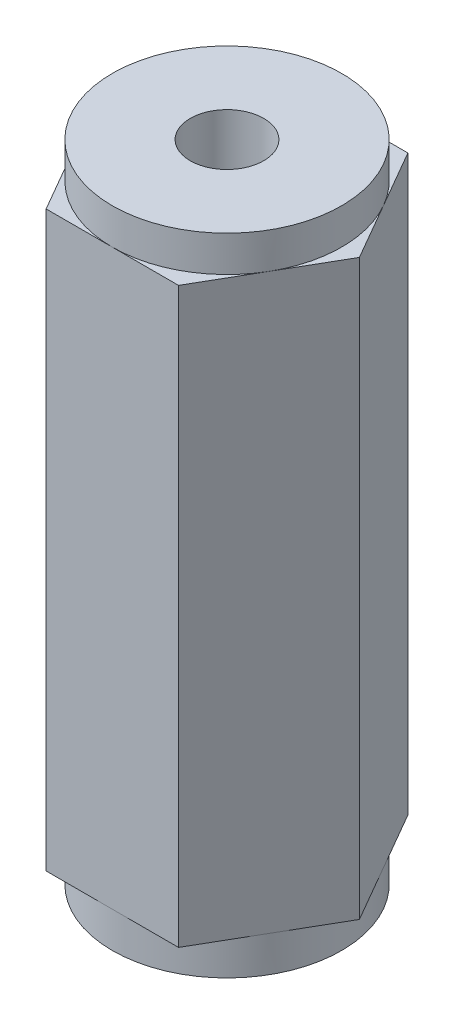
ISO-10303-21;
HEADER;
FILE_DESCRIPTION(('STEP AP214'),'2;1');
FILE_NAME('part.step','',(''),(''),'','','');
FILE_SCHEMA(('AUTOMOTIVE_DESIGN { 1 0 10303 214 1 1 1 1 }'));
ENDSEC;
DATA;
#1=APPLICATION_CONTEXT('core data for automotive mechanical design processes');
#2=APPLICATION_PROTOCOL_DEFINITION('international standard','automotive_design',2000,#1);
#3=PRODUCT_CONTEXT('',#1,'mechanical');
#4=PRODUCT('Part','Part','',(#3));
#5=PRODUCT_RELATED_PRODUCT_CATEGORY('part','',(#4));
#6=PRODUCT_DEFINITION_FORMATION('','',#4);
#7=PRODUCT_DEFINITION_CONTEXT('part definition',#1,'design');
#8=PRODUCT_DEFINITION('design','',#6,#7);
#9=PRODUCT_DEFINITION_SHAPE('','',#8);
#10=(LENGTH_UNIT() NAMED_UNIT(*) SI_UNIT(.MILLI.,.METRE.));
#11=(NAMED_UNIT(*) PLANE_ANGLE_UNIT() SI_UNIT($,.RADIAN.));
#12=(NAMED_UNIT(*) SI_UNIT($,.STERADIAN.) SOLID_ANGLE_UNIT());
#13=UNCERTAINTY_MEASURE_WITH_UNIT(LENGTH_MEASURE(1.E-05),#10,'distance_accuracy_value','');
#14=(GEOMETRIC_REPRESENTATION_CONTEXT(3) GLOBAL_UNCERTAINTY_ASSIGNED_CONTEXT((#13)) GLOBAL_UNIT_ASSIGNED_CONTEXT((#10,
#11,#12)) REPRESENTATION_CONTEXT('',''));
#15=CARTESIAN_POINT('',(0.,0.,0.));
#16=DIRECTION('',(0.,0.,1.));
#17=DIRECTION('',(1.,0.,0.));
#18=AXIS2_PLACEMENT_3D('',#15,#16,#17);
#19=CARTESIAN_POINT('',(1.84752086140684,9.,3.19999999999998));
#20=DIRECTION('',(-0.866025403784442,0.,-0.499999999999995));
#21=DIRECTION('',(-0.499999999999995,0.,0.866025403784442));
#22=AXIS2_PLACEMENT_3D('',#19,#20,#21);
#23=PLANE('',#22);
#24=DIRECTION('',(-0.499999999999995,0.,0.866025403784442));
#25=VECTOR('',#24,1.);
#26=CARTESIAN_POINT('',(1.84752086140684,-8.,3.19999999999998));
#27=LINE('',#26,#25);
#28=CARTESIAN_POINT('',(3.69504172281361,-8.,0.));
#29=VERTEX_POINT('',#28);
#30=CARTESIAN_POINT('',(2.77128129211022,-8.,1.59999999999999));
#31=VERTEX_POINT('',#30);
#32=EDGE_CURVE('E162',#29,#31,#27,.T.);
#33=ORIENTED_EDGE('',*,*,#32,.F.);
#34=DIRECTION('',(0.,-1.,0.));
#35=VECTOR('',#34,1.);
#36=CARTESIAN_POINT('',(3.69504172281361,9.,0.));
#37=LINE('',#36,#35);
#38=CARTESIAN_POINT('',(3.69504172281361,8.,0.));
#39=VERTEX_POINT('',#38);
#40=EDGE_CURVE('E205',#39,#29,#37,.T.);
#41=ORIENTED_EDGE('',*,*,#40,.F.);
#42=DIRECTION('',(0.499999999999995,0.,-0.866025403784442));
#43=VECTOR('',#42,1.);
#44=CARTESIAN_POINT('',(1.84752086140684,8.,3.19999999999998));
#45=LINE('',#44,#43);
#46=CARTESIAN_POINT('',(2.77128129211022,8.,1.59999999999999));
#47=VERTEX_POINT('',#46);
#48=EDGE_CURVE('E187',#47,#39,#45,.T.);
#49=ORIENTED_EDGE('',*,*,#48,.F.);
#50=CARTESIAN_POINT('',(1.84752086140684,8.,3.19999999999998));
#51=VERTEX_POINT('',#50);
#52=EDGE_CURVE('E189',#51,#47,#45,.T.);
#53=ORIENTED_EDGE('',*,*,#52,.F.);
#54=DIRECTION('',(0.,-1.,0.));
#55=VECTOR('',#54,1.);
#56=CARTESIAN_POINT('',(1.84752086140684,9.,3.19999999999998));
#57=LINE('',#56,#55);
#58=CARTESIAN_POINT('',(1.84752086140684,-8.,3.19999999999998));
#59=VERTEX_POINT('',#58);
#60=EDGE_CURVE('E190',#51,#59,#57,.T.);
#61=ORIENTED_EDGE('',*,*,#60,.T.);
#62=EDGE_CURVE('E159',#31,#59,#27,.T.);
#63=ORIENTED_EDGE('',*,*,#62,.F.);
#64=EDGE_LOOP('',(#33,#41,#49,#53,#61,#63));
#65=FACE_BOUND('',#64,.T.);
#66=ADVANCED_FACE('F39',(#65),#23,.F.);
#67=CARTESIAN_POINT('',(3.69504172281361,9.,0.));
#68=DIRECTION('',(-0.866025403784438,0.,0.500000000000001));
#69=DIRECTION('',(0.500000000000001,0.,0.866025403784438));
#70=AXIS2_PLACEMENT_3D('',#67,#68,#69);
#71=PLANE('',#70);
#72=DIRECTION('',(0.500000000000001,0.,0.866025403784438));
#73=VECTOR('',#72,1.);
#74=CARTESIAN_POINT('',(3.69504172281361,-8.,0.));
#75=LINE('',#74,#73);
#76=CARTESIAN_POINT('',(1.8475208614068,-8.,-3.20000000000001));
#77=VERTEX_POINT('',#76);
#78=CARTESIAN_POINT('',(2.77128129211021,-8.,-1.60000000000001));
#79=VERTEX_POINT('',#78);
#80=EDGE_CURVE('E168',#77,#79,#75,.T.);
#81=ORIENTED_EDGE('',*,*,#80,.F.);
#82=DIRECTION('',(0.,-1.,0.));
#83=VECTOR('',#82,1.);
#84=CARTESIAN_POINT('',(1.8475208614068,9.,-3.20000000000001));
#85=LINE('',#84,#83);
#86=CARTESIAN_POINT('',(1.8475208614068,8.,-3.20000000000001));
#87=VERTEX_POINT('',#86);
#88=EDGE_CURVE('E202',#87,#77,#85,.T.);
#89=ORIENTED_EDGE('',*,*,#88,.F.);
#90=DIRECTION('',(-0.500000000000001,0.,-0.866025403784438));
#91=VECTOR('',#90,1.);
#92=CARTESIAN_POINT('',(3.69504172281361,8.,0.));
#93=LINE('',#92,#91);
#94=CARTESIAN_POINT('',(2.77128129211021,8.,-1.60000000000001));
#95=VERTEX_POINT('',#94);
#96=EDGE_CURVE('E184',#95,#87,#93,.T.);
#97=ORIENTED_EDGE('',*,*,#96,.F.);
#98=EDGE_CURVE('E186',#39,#95,#93,.T.);
#99=ORIENTED_EDGE('',*,*,#98,.F.);
#100=ORIENTED_EDGE('',*,*,#40,.T.);
#101=EDGE_CURVE('E165',#79,#29,#75,.T.);
#102=ORIENTED_EDGE('',*,*,#101,.F.);
#103=EDGE_LOOP('',(#81,#89,#97,#99,#100,#102));
#104=FACE_BOUND('',#103,.T.);
#105=ADVANCED_FACE('F246',(#104),#71,.F.);
#106=CARTESIAN_POINT('',(1.8475208614068,9.,-3.20000000000001));
#107=DIRECTION('',(0.,0.,1.));
#108=DIRECTION('',(1.,0.,0.));
#109=AXIS2_PLACEMENT_3D('',#106,#107,#108);
#110=PLANE('',#109);
#111=DIRECTION('',(1.,0.,0.));
#112=VECTOR('',#111,1.);
#113=CARTESIAN_POINT('',(1.8475208614068,-8.,-3.20000000000001));
#114=LINE('',#113,#112);
#115=CARTESIAN_POINT('',(-1.84752086140682,-8.,-3.19999999999999));
#116=VERTEX_POINT('',#115);
#117=CARTESIAN_POINT('',(0.,-8.,-3.20000000000001));
#118=VERTEX_POINT('',#117);
#119=EDGE_CURVE('E171',#116,#118,#114,.T.);
#120=ORIENTED_EDGE('',*,*,#119,.F.);
#121=DIRECTION('',(0.,-1.,0.));
#122=VECTOR('',#121,1.);
#123=CARTESIAN_POINT('',(-1.84752086140682,9.,-3.19999999999999));
#124=LINE('',#123,#122);
#125=CARTESIAN_POINT('',(-1.84752086140682,8.,-3.19999999999999));
#126=VERTEX_POINT('',#125);
#127=EDGE_CURVE('E199',#126,#116,#124,.T.);
#128=ORIENTED_EDGE('',*,*,#127,.F.);
#129=DIRECTION('',(-1.,0.,0.));
#130=VECTOR('',#129,1.);
#131=CARTESIAN_POINT('',(1.8475208614068,8.,-3.20000000000001));
#132=LINE('',#131,#130);
#133=CARTESIAN_POINT('',(0.,8.,-3.20000000000001));
#134=VERTEX_POINT('',#133);
#135=EDGE_CURVE('E181',#134,#126,#132,.T.);
#136=ORIENTED_EDGE('',*,*,#135,.F.);
#137=EDGE_CURVE('E183',#87,#134,#132,.T.);
#138=ORIENTED_EDGE('',*,*,#137,.F.);
#139=ORIENTED_EDGE('',*,*,#88,.T.);
#140=EDGE_CURVE('E169',#118,#77,#114,.T.);
#141=ORIENTED_EDGE('',*,*,#140,.F.);
#142=EDGE_LOOP('',(#120,#128,#136,#138,#139,#141));
#143=FACE_BOUND('',#142,.T.);
#144=ADVANCED_FACE('F258',(#143),#110,.F.);
#145=CARTESIAN_POINT('',(-1.84752086140682,9.,-3.19999999999999));
#146=DIRECTION('',(0.866025403784441,0.,0.499999999999995));
#147=DIRECTION('',(0.499999999999995,0.,-0.866025403784442));
#148=AXIS2_PLACEMENT_3D('',#145,#146,#147);
#149=PLANE('',#148);
#150=DIRECTION('',(0.499999999999995,0.,-0.866025403784442));
#151=VECTOR('',#150,1.);
#152=CARTESIAN_POINT('',(-1.84752086140682,-8.,-3.19999999999999));
#153=LINE('',#152,#151);
#154=CARTESIAN_POINT('',(-3.69504172281361,-8.,0.));
#155=VERTEX_POINT('',#154);
#156=CARTESIAN_POINT('',(-2.77128129211022,-8.,-1.59999999999999));
#157=VERTEX_POINT('',#156);
#158=EDGE_CURVE('E163',#155,#157,#153,.T.);
#159=ORIENTED_EDGE('',*,*,#158,.F.);
#160=DIRECTION('',(0.,-1.,0.));
#161=VECTOR('',#160,1.);
#162=CARTESIAN_POINT('',(-3.69504172281361,9.,0.));
#163=LINE('',#162,#161);
#164=CARTESIAN_POINT('',(-3.69504172281361,8.,0.));
#165=VERTEX_POINT('',#164);
#166=EDGE_CURVE('E196',#165,#155,#163,.T.);
#167=ORIENTED_EDGE('',*,*,#166,.F.);
#168=DIRECTION('',(-0.499999999999995,0.,0.866025403784442));
#169=VECTOR('',#168,1.);
#170=CARTESIAN_POINT('',(-1.84752086140682,8.,-3.19999999999999));
#171=LINE('',#170,#169);
#172=CARTESIAN_POINT('',(-2.77128129211022,8.,-1.59999999999999));
#173=VERTEX_POINT('',#172);
#174=EDGE_CURVE('E178',#173,#165,#171,.T.);
#175=ORIENTED_EDGE('',*,*,#174,.F.);
#176=EDGE_CURVE('E180',#126,#173,#171,.T.);
#177=ORIENTED_EDGE('',*,*,#176,.F.);
#178=ORIENTED_EDGE('',*,*,#127,.T.);
#179=EDGE_CURVE('E166',#157,#116,#153,.T.);
#180=ORIENTED_EDGE('',*,*,#179,.F.);
#181=EDGE_LOOP('',(#159,#167,#175,#177,#178,#180));
#182=FACE_BOUND('',#181,.T.);
#183=ADVANCED_FACE('F270',(#182),#149,.F.);
#184=CARTESIAN_POINT('',(-3.69504172281361,9.,0.));
#185=DIRECTION('',(0.866025403784434,0.,-0.500000000000007));
#186=DIRECTION('',(-0.500000000000007,0.,-0.866025403784435));
#187=AXIS2_PLACEMENT_3D('',#184,#185,#186);
#188=PLANE('',#187);
#189=DIRECTION('',(-0.500000000000007,0.,-0.866025403784435));
#190=VECTOR('',#189,1.);
#191=CARTESIAN_POINT('',(-3.69504172281361,-8.,0.));
#192=LINE('',#191,#190);
#193=CARTESIAN_POINT('',(-1.84752086140677,-8.,3.20000000000002));
#194=VERTEX_POINT('',#193);
#195=CARTESIAN_POINT('',(-2.7712812921102,-8.,1.60000000000003));
#196=VERTEX_POINT('',#195);
#197=EDGE_CURVE('E156',#194,#196,#192,.T.);
#198=ORIENTED_EDGE('',*,*,#197,.F.);
#199=DIRECTION('',(0.,-1.,0.));
#200=VECTOR('',#199,1.);
#201=CARTESIAN_POINT('',(-1.84752086140677,9.,3.20000000000002));
#202=LINE('',#201,#200);
#203=CARTESIAN_POINT('',(-1.84752086140677,8.,3.20000000000002));
#204=VERTEX_POINT('',#203);
#205=EDGE_CURVE('E193',#204,#194,#202,.T.);
#206=ORIENTED_EDGE('',*,*,#205,.F.);
#207=DIRECTION('',(0.500000000000007,0.,0.866025403784435));
#208=VECTOR('',#207,1.);
#209=CARTESIAN_POINT('',(-3.69504172281361,8.,0.));
#210=LINE('',#209,#208);
#211=CARTESIAN_POINT('',(-2.7712812921102,8.,1.60000000000003));
#212=VERTEX_POINT('',#211);
#213=EDGE_CURVE('E173',#212,#204,#210,.T.);
#214=ORIENTED_EDGE('',*,*,#213,.F.);
#215=EDGE_CURVE('E177',#165,#212,#210,.T.);
#216=ORIENTED_EDGE('',*,*,#215,.F.);
#217=ORIENTED_EDGE('',*,*,#166,.T.);
#218=EDGE_CURVE('E160',#196,#155,#192,.T.);
#219=ORIENTED_EDGE('',*,*,#218,.F.);
#220=EDGE_LOOP('',(#198,#206,#214,#216,#217,#219));
#221=FACE_BOUND('',#220,.T.);
#222=ADVANCED_FACE('F279',(#221),#188,.F.);
#223=CARTESIAN_POINT('',(-1.84752086140677,9.,3.20000000000002));
#224=DIRECTION('',(0.,0.,-1.));
#225=DIRECTION('',(-1.,0.,0.));
#226=AXIS2_PLACEMENT_3D('',#223,#224,#225);
#227=PLANE('',#226);
#228=DIRECTION('',(-1.,0.,0.));
#229=VECTOR('',#228,1.);
#230=CARTESIAN_POINT('',(-1.84752086140677,-8.,3.20000000000002));
#231=LINE('',#230,#229);
#232=CARTESIAN_POINT('',(0.,-8.,3.20000000000001));
#233=VERTEX_POINT('',#232);
#234=EDGE_CURVE('E12',#59,#233,#231,.T.);
#235=ORIENTED_EDGE('',*,*,#234,.F.);
#236=ORIENTED_EDGE('',*,*,#60,.F.);
#237=DIRECTION('',(1.,0.,0.));
#238=VECTOR('',#237,1.);
#239=CARTESIAN_POINT('',(-1.84752086140677,8.,3.20000000000002));
#240=LINE('',#239,#238);
#241=CARTESIAN_POINT('',(0.,8.,3.20000000000001));
#242=VERTEX_POINT('',#241);
#243=EDGE_CURVE('E211',#242,#51,#240,.T.);
#244=ORIENTED_EDGE('',*,*,#243,.F.);
#245=EDGE_CURVE('E212',#204,#242,#240,.T.);
#246=ORIENTED_EDGE('',*,*,#245,.F.);
#247=ORIENTED_EDGE('',*,*,#205,.T.);
#248=EDGE_CURVE('E42',#233,#194,#231,.T.);
#249=ORIENTED_EDGE('',*,*,#248,.F.);
#250=EDGE_LOOP('',(#235,#236,#244,#246,#247,#249));
#251=FACE_BOUND('',#250,.T.);
#252=ADVANCED_FACE('F229',(#251),#227,.F.);
#253=CARTESIAN_POINT('',(0.,8.,0.));
#254=DIRECTION('',(0.,1.,0.));
#255=DIRECTION('',(0.,0.,1.));
#256=AXIS2_PLACEMENT_3D('',#253,#254,#255);
#257=PLANE('',#256);
#258=ORIENTED_EDGE('',*,*,#52,.T.);
#259=CARTESIAN_POINT('',(0.,8.,0.));
#260=DIRECTION('',(0.,1.,0.));
#261=DIRECTION('',(0.,0.,1.));
#262=AXIS2_PLACEMENT_3D('',#259,#260,#261);
#263=CIRCLE('',#262,3.20000000000001);
#264=EDGE_CURVE('E61',#242,#47,#263,.T.);
#265=ORIENTED_EDGE('',*,*,#264,.F.);
#266=ORIENTED_EDGE('',*,*,#243,.T.);
#267=EDGE_LOOP('',(#258,#265,#266));
#268=FACE_BOUND('',#267,.T.);
#269=ADVANCED_FACE('F231',(#268),#257,.T.);
#270=ORIENTED_EDGE('',*,*,#48,.T.);
#271=ORIENTED_EDGE('',*,*,#98,.T.);
#272=EDGE_CURVE('E174',#47,#95,#263,.T.);
#273=ORIENTED_EDGE('',*,*,#272,.F.);
#274=EDGE_LOOP('',(#270,#271,#273));
#275=FACE_BOUND('',#274,.T.);
#276=ADVANCED_FACE('F240',(#275),#257,.T.);
#277=ORIENTED_EDGE('',*,*,#96,.T.);
#278=ORIENTED_EDGE('',*,*,#137,.T.);
#279=EDGE_CURVE('E254',#95,#134,#263,.T.);
#280=ORIENTED_EDGE('',*,*,#279,.F.);
#281=EDGE_LOOP('',(#277,#278,#280));
#282=FACE_BOUND('',#281,.T.);
#283=ADVANCED_FACE('F251',(#282),#257,.T.);
#284=ORIENTED_EDGE('',*,*,#135,.T.);
#285=ORIENTED_EDGE('',*,*,#176,.T.);
#286=EDGE_CURVE('E266',#134,#173,#263,.T.);
#287=ORIENTED_EDGE('',*,*,#286,.F.);
#288=EDGE_LOOP('',(#284,#285,#287));
#289=FACE_BOUND('',#288,.T.);
#290=ADVANCED_FACE('F263',(#289),#257,.T.);
#291=ORIENTED_EDGE('',*,*,#174,.T.);
#292=ORIENTED_EDGE('',*,*,#215,.T.);
#293=EDGE_CURVE('E276',#173,#212,#263,.T.);
#294=ORIENTED_EDGE('',*,*,#293,.F.);
#295=EDGE_LOOP('',(#291,#292,#294));
#296=FACE_BOUND('',#295,.T.);
#297=ADVANCED_FACE('F275',(#296),#257,.T.);
#298=ORIENTED_EDGE('',*,*,#213,.T.);
#299=ORIENTED_EDGE('',*,*,#245,.T.);
#300=EDGE_CURVE('E175',#212,#242,#263,.T.);
#301=ORIENTED_EDGE('',*,*,#300,.F.);
#302=EDGE_LOOP('',(#298,#299,#301));
#303=FACE_BOUND('',#302,.T.);
#304=ADVANCED_FACE('F222',(#303),#257,.T.);
#305=CARTESIAN_POINT('',(0.,8.,0.));
#306=DIRECTION('',(0.,1.,0.));
#307=DIRECTION('',(0.,0.,1.));
#308=AXIS2_PLACEMENT_3D('',#305,#306,#307);
#309=CYLINDRICAL_SURFACE('',#308,3.20000000000001);
#310=CARTESIAN_POINT('',(0.,9.,0.));
#311=DIRECTION('',(0.,1.,0.));
#312=DIRECTION('',(0.,0.,1.));
#313=AXIS2_PLACEMENT_3D('',#310,#311,#312);
#314=CIRCLE('',#313,3.20000000000001);
#315=CARTESIAN_POINT('',(0.,9.,3.20000000000001));
#316=VERTEX_POINT('',#315);
#317=EDGE_CURVE('E208',#316,#316,#314,.T.);
#318=ORIENTED_EDGE('',*,*,#317,.F.);
#319=EDGE_LOOP('',(#318));
#320=FACE_BOUND('',#319,.T.);
#321=ORIENTED_EDGE('',*,*,#264,.T.);
#322=ORIENTED_EDGE('',*,*,#272,.T.);
#323=ORIENTED_EDGE('',*,*,#279,.T.);
#324=ORIENTED_EDGE('',*,*,#286,.T.);
#325=ORIENTED_EDGE('',*,*,#293,.T.);
#326=ORIENTED_EDGE('',*,*,#300,.T.);
#327=EDGE_LOOP('',(#321,#322,#323,#324,#325,#326));
#328=FACE_BOUND('',#327,.T.);
#329=ADVANCED_FACE('F337',(#320,#328),#309,.T.);
#330=CARTESIAN_POINT('',(0.,9.,0.));
#331=DIRECTION('',(0.,1.,0.));
#332=DIRECTION('',(0.,0.,1.));
#333=AXIS2_PLACEMENT_3D('',#330,#331,#332);
#334=PLANE('',#333);
#335=CARTESIAN_POINT('',(0.,9.,0.));
#336=DIRECTION('',(0.,1.,0.));
#337=DIRECTION('',(0.,0.,1.));
#338=AXIS2_PLACEMENT_3D('',#335,#336,#337);
#339=CIRCLE('',#338,1.025);
#340=CARTESIAN_POINT('',(0.,9.,1.025));
#341=VERTEX_POINT('',#340);
#342=EDGE_CURVE('E143',#341,#341,#339,.T.);
#343=ORIENTED_EDGE('',*,*,#342,.F.);
#344=EDGE_LOOP('',(#343));
#345=FACE_BOUND('',#344,.T.);
#346=ORIENTED_EDGE('',*,*,#317,.T.);
#347=EDGE_LOOP('',(#346));
#348=FACE_BOUND('',#347,.T.);
#349=ADVANCED_FACE('F334',(#345,#348),#334,.T.);
#350=CARTESIAN_POINT('',(0.,-8.,0.));
#351=DIRECTION('',(0.,-1.,0.));
#352=DIRECTION('',(0.,0.,-1.));
#353=AXIS2_PLACEMENT_3D('',#350,#351,#352);
#354=PLANE('',#353);
#355=ORIENTED_EDGE('',*,*,#119,.T.);
#356=CARTESIAN_POINT('',(0.,-8.,0.));
#357=DIRECTION('',(0.,1.,0.));
#358=DIRECTION('',(0.,0.,1.));
#359=AXIS2_PLACEMENT_3D('',#356,#357,#358);
#360=CIRCLE('',#359,3.20000000000001);
#361=EDGE_CURVE('E303',#118,#157,#360,.T.);
#362=ORIENTED_EDGE('',*,*,#361,.T.);
#363=ORIENTED_EDGE('',*,*,#179,.T.);
#364=EDGE_LOOP('',(#355,#362,#363));
#365=FACE_BOUND('',#364,.T.);
#366=ADVANCED_FACE('F311',(#365),#354,.T.);
#367=ORIENTED_EDGE('',*,*,#140,.T.);
#368=ORIENTED_EDGE('',*,*,#80,.T.);
#369=EDGE_CURVE('E299',#79,#118,#360,.T.);
#370=ORIENTED_EDGE('',*,*,#369,.T.);
#371=EDGE_LOOP('',(#367,#368,#370));
#372=FACE_BOUND('',#371,.T.);
#373=ADVANCED_FACE('F298',(#372),#354,.T.);
#374=ORIENTED_EDGE('',*,*,#101,.T.);
#375=ORIENTED_EDGE('',*,*,#32,.T.);
#376=EDGE_CURVE('E157',#31,#79,#360,.T.);
#377=ORIENTED_EDGE('',*,*,#376,.T.);
#378=EDGE_LOOP('',(#374,#375,#377));
#379=FACE_BOUND('',#378,.T.);
#380=ADVANCED_FACE('F304',(#379),#354,.T.);
#381=ORIENTED_EDGE('',*,*,#158,.T.);
#382=EDGE_CURVE('E286',#157,#196,#360,.T.);
#383=ORIENTED_EDGE('',*,*,#382,.T.);
#384=ORIENTED_EDGE('',*,*,#218,.T.);
#385=EDGE_LOOP('',(#381,#383,#384));
#386=FACE_BOUND('',#385,.T.);
#387=ADVANCED_FACE('F292',(#386),#354,.T.);
#388=ORIENTED_EDGE('',*,*,#62,.T.);
#389=ORIENTED_EDGE('',*,*,#234,.T.);
#390=EDGE_CURVE('E53',#233,#31,#360,.T.);
#391=ORIENTED_EDGE('',*,*,#390,.T.);
#392=EDGE_LOOP('',(#388,#389,#391));
#393=FACE_BOUND('',#392,.T.);
#394=ADVANCED_FACE('F288',(#393),#354,.T.);
#395=ORIENTED_EDGE('',*,*,#197,.T.);
#396=EDGE_CURVE('E154',#196,#233,#360,.T.);
#397=ORIENTED_EDGE('',*,*,#396,.T.);
#398=ORIENTED_EDGE('',*,*,#248,.T.);
#399=EDGE_LOOP('',(#395,#397,#398));
#400=FACE_BOUND('',#399,.T.);
#401=ADVANCED_FACE('F283',(#400),#354,.T.);
#402=CARTESIAN_POINT('',(0.,-8.,0.));
#403=DIRECTION('',(0.,-1.,0.));
#404=DIRECTION('',(0.,0.,-1.));
#405=AXIS2_PLACEMENT_3D('',#402,#403,#404);
#406=CYLINDRICAL_SURFACE('',#405,3.20000000000001);
#407=ORIENTED_EDGE('',*,*,#376,.F.);
#408=ORIENTED_EDGE('',*,*,#390,.F.);
#409=ORIENTED_EDGE('',*,*,#396,.F.);
#410=ORIENTED_EDGE('',*,*,#382,.F.);
#411=ORIENTED_EDGE('',*,*,#361,.F.);
#412=ORIENTED_EDGE('',*,*,#369,.F.);
#413=EDGE_LOOP('',(#407,#408,#409,#410,#411,#412));
#414=FACE_BOUND('',#413,.T.);
#415=CARTESIAN_POINT('',(0.,-9.,0.));
#416=DIRECTION('',(0.,1.,0.));
#417=DIRECTION('',(0.,0.,1.));
#418=AXIS2_PLACEMENT_3D('',#415,#416,#417);
#419=CIRCLE('',#418,3.20000000000001);
#420=CARTESIAN_POINT('',(0.,-9.,3.20000000000001));
#421=VERTEX_POINT('',#420);
#422=EDGE_CURVE('E213',#421,#421,#419,.F.);
#423=ORIENTED_EDGE('',*,*,#422,.F.);
#424=EDGE_LOOP('',(#423));
#425=FACE_BOUND('',#424,.T.);
#426=ADVANCED_FACE('F301',(#414,#425),#406,.T.);
#427=CARTESIAN_POINT('',(0.,-9.,0.));
#428=DIRECTION('',(0.,1.,0.));
#429=DIRECTION('',(0.,0.,1.));
#430=AXIS2_PLACEMENT_3D('',#427,#428,#429);
#431=PLANE('',#430);
#432=CARTESIAN_POINT('',(0.,-9.,0.));
#433=DIRECTION('',(0.,-1.,0.));
#434=DIRECTION('',(0.,0.,-1.));
#435=AXIS2_PLACEMENT_3D('',#432,#433,#434);
#436=CIRCLE('',#435,1.025);
#437=CARTESIAN_POINT('',(0.,-9.,-1.025));
#438=VERTEX_POINT('',#437);
#439=EDGE_CURVE('E144',#438,#438,#436,.T.);
#440=ORIENTED_EDGE('',*,*,#439,.F.);
#441=EDGE_LOOP('',(#440));
#442=FACE_BOUND('',#441,.T.);
#443=ORIENTED_EDGE('',*,*,#422,.T.);
#444=EDGE_LOOP('',(#443));
#445=FACE_BOUND('',#444,.T.);
#446=ADVANCED_FACE('F329',(#442,#445),#431,.F.);
#447=CARTESIAN_POINT('',(0.,2.65,0.));
#448=DIRECTION('',(0.,1.,0.));
#449=DIRECTION('',(0.,0.,1.));
#450=AXIS2_PLACEMENT_3D('',#447,#448,#449);
#451=CONICAL_SURFACE('',#450,1.025,1.02974425867665);
#452=CARTESIAN_POINT('',(0.,2.03411786549675,0.));
#453=VERTEX_POINT('',#452);
#454=VERTEX_LOOP('',#453);
#455=FACE_BOUND('',#454,.T.);
#456=CARTESIAN_POINT('',(0.,2.65,0.));
#457=DIRECTION('',(0.,1.,0.));
#458=DIRECTION('',(0.,0.,1.));
#459=AXIS2_PLACEMENT_3D('',#456,#457,#458);
#460=CIRCLE('',#459,1.025);
#461=CARTESIAN_POINT('',(0.,2.65,1.025));
#462=VERTEX_POINT('',#461);
#463=EDGE_CURVE('E147',#462,#462,#460,.T.);
#464=ORIENTED_EDGE('',*,*,#463,.T.);
#465=EDGE_LOOP('',(#464));
#466=FACE_BOUND('',#465,.T.);
#467=ADVANCED_FACE('F332',(#455,#466),#451,.F.);
#468=CARTESIAN_POINT('',(0.,9.,0.));
#469=DIRECTION('',(0.,1.,0.));
#470=DIRECTION('',(0.,0.,1.));
#471=AXIS2_PLACEMENT_3D('',#468,#469,#470);
#472=CYLINDRICAL_SURFACE('',#471,1.025);
#473=ORIENTED_EDGE('',*,*,#463,.F.);
#474=EDGE_LOOP('',(#473));
#475=FACE_BOUND('',#474,.T.);
#476=ORIENTED_EDGE('',*,*,#342,.T.);
#477=EDGE_LOOP('',(#476));
#478=FACE_BOUND('',#477,.T.);
#479=ADVANCED_FACE('F137',(#475,#478),#472,.F.);
#480=CARTESIAN_POINT('',(0.,-2.65,0.));
#481=DIRECTION('',(0.,-1.,0.));
#482=DIRECTION('',(0.,0.,-1.));
#483=AXIS2_PLACEMENT_3D('',#480,#481,#482);
#484=CONICAL_SURFACE('',#483,1.025,1.02974425867665);
#485=CARTESIAN_POINT('',(0.,-2.03411786549675,0.));
#486=VERTEX_POINT('',#485);
#487=VERTEX_LOOP('',#486);
#488=FACE_BOUND('',#487,.T.);
#489=CARTESIAN_POINT('',(0.,-2.65,0.));
#490=DIRECTION('',(0.,-1.,0.));
#491=DIRECTION('',(0.,0.,-1.));
#492=AXIS2_PLACEMENT_3D('',#489,#490,#491);
#493=CIRCLE('',#492,1.025);
#494=CARTESIAN_POINT('',(0.,-2.65,-1.025));
#495=VERTEX_POINT('',#494);
#496=EDGE_CURVE('E141',#495,#495,#493,.T.);
#497=ORIENTED_EDGE('',*,*,#496,.T.);
#498=EDGE_LOOP('',(#497));
#499=FACE_BOUND('',#498,.T.);
#500=ADVANCED_FACE('F133',(#488,#499),#484,.F.);
#501=CARTESIAN_POINT('',(0.,-9.,0.));
#502=DIRECTION('',(0.,-1.,0.));
#503=DIRECTION('',(0.,0.,-1.));
#504=AXIS2_PLACEMENT_3D('',#501,#502,#503);
#505=CYLINDRICAL_SURFACE('',#504,1.025);
#506=ORIENTED_EDGE('',*,*,#496,.F.);
#507=EDGE_LOOP('',(#506));
#508=FACE_BOUND('',#507,.T.);
#509=ORIENTED_EDGE('',*,*,#439,.T.);
#510=EDGE_LOOP('',(#509));
#511=FACE_BOUND('',#510,.T.);
#512=ADVANCED_FACE('F136',(#508,#511),#505,.F.);
#513=CLOSED_SHELL('',(#66,#105,#144,#183,#222,#252,#269,#276,#283,#290,#297,#304,#329,#349,#366,
#373,#380,#387,#394,#401,#426,#446,#467,#479,#500,#512));
#514=MANIFOLD_SOLID_BREP('B2',#513);
#515=ADVANCED_BREP_SHAPE_REPRESENTATION('',(#18,#514),#14);
#516=SHAPE_DEFINITION_REPRESENTATION(#9,#515);
ENDSEC;
END-ISO-10303-21;
